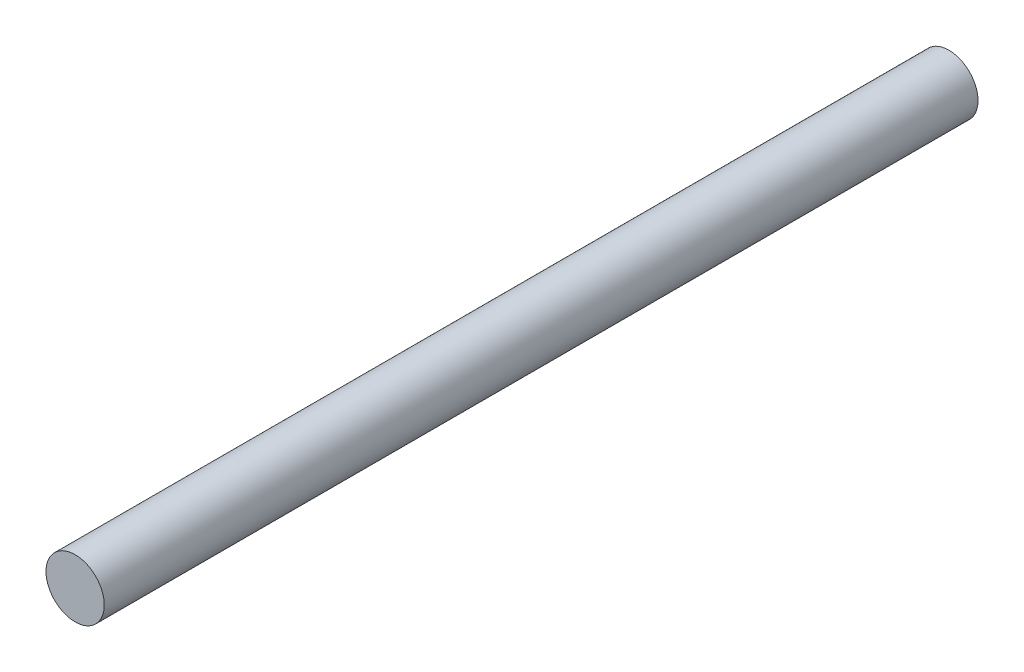
ISO-10303-21;
HEADER;
FILE_DESCRIPTION(('STEP AP214'),'2;1');
FILE_NAME('part.step','',(''),(''),'','','');
FILE_SCHEMA(('AUTOMOTIVE_DESIGN { 1 0 10303 214 1 1 1 1 }'));
ENDSEC;
DATA;
#1=APPLICATION_CONTEXT('core data for automotive mechanical design processes');
#2=APPLICATION_PROTOCOL_DEFINITION('international standard','automotive_design',2000,#1);
#3=PRODUCT_CONTEXT('',#1,'mechanical');
#4=PRODUCT('Part','Part','',(#3));
#5=PRODUCT_RELATED_PRODUCT_CATEGORY('part','',(#4));
#6=PRODUCT_DEFINITION_FORMATION('','',#4);
#7=PRODUCT_DEFINITION_CONTEXT('part definition',#1,'design');
#8=PRODUCT_DEFINITION('design','',#6,#7);
#9=PRODUCT_DEFINITION_SHAPE('','',#8);
#10=(LENGTH_UNIT() NAMED_UNIT(*) SI_UNIT(.MILLI.,.METRE.));
#11=(NAMED_UNIT(*) PLANE_ANGLE_UNIT() SI_UNIT($,.RADIAN.));
#12=(NAMED_UNIT(*) SI_UNIT($,.STERADIAN.) SOLID_ANGLE_UNIT());
#13=UNCERTAINTY_MEASURE_WITH_UNIT(LENGTH_MEASURE(1.E-05),#10,'distance_accuracy_value','');
#14=(GEOMETRIC_REPRESENTATION_CONTEXT(3) GLOBAL_UNCERTAINTY_ASSIGNED_CONTEXT((#13)) GLOBAL_UNIT_ASSIGNED_CONTEXT((#10,
#11,#12)) REPRESENTATION_CONTEXT('',''));
#15=CARTESIAN_POINT('',(0.,0.,0.));
#16=DIRECTION('',(0.,0.,1.));
#17=DIRECTION('',(1.,0.,0.));
#18=AXIS2_PLACEMENT_3D('',#15,#16,#17);
#19=CARTESIAN_POINT('',(0.,0.,90.));
#20=DIRECTION('',(0.,0.,-1.));
#21=DIRECTION('',(-1.,0.,0.));
#22=AXIS2_PLACEMENT_3D('',#19,#20,#21);
#23=CYLINDRICAL_SURFACE('',#22,3.);
#24=CARTESIAN_POINT('',(0.,0.,90.));
#25=DIRECTION('',(0.,0.,1.));
#26=DIRECTION('',(1.,0.,0.));
#27=AXIS2_PLACEMENT_3D('',#24,#25,#26);
#28=CIRCLE('',#27,3.);
#29=CARTESIAN_POINT('',(-3.,0.,90.));
#30=VERTEX_POINT('',#29);
#31=EDGE_CURVE('E10',#30,#30,#28,.T.);
#32=CARTESIAN_POINT('',(0.,0.,0.));
#33=DIRECTION('',(0.,0.,1.));
#34=DIRECTION('',(1.,0.,0.));
#35=AXIS2_PLACEMENT_3D('',#32,#33,#34);
#36=CIRCLE('',#35,3.);
#37=CARTESIAN_POINT('',(-3.,0.,0.));
#38=VERTEX_POINT('',#37);
#39=EDGE_CURVE('E40',#38,#38,#36,.T.);
#40=CARTESIAN_POINT('',(-3.,0.,90.));
#41=CARTESIAN_POINT('',(-3.,0.,89.0625));
#42=CARTESIAN_POINT('',(-3.,0.,88.125));
#43=CARTESIAN_POINT('',(-3.,0.,86.25));
#44=CARTESIAN_POINT('',(-3.,0.,85.3125));
#45=CARTESIAN_POINT('',(-3.,0.,83.4375));
#46=CARTESIAN_POINT('',(-3.,0.,82.5));
#47=CARTESIAN_POINT('',(-3.,0.,80.625));
#48=CARTESIAN_POINT('',(-3.,0.,79.6875));
#49=CARTESIAN_POINT('',(-3.,0.,77.8125));
#50=CARTESIAN_POINT('',(-3.,0.,76.875));
#51=CARTESIAN_POINT('',(-3.,0.,75.));
#52=CARTESIAN_POINT('',(-3.,0.,74.0625));
#53=CARTESIAN_POINT('',(-3.,0.,72.1875));
#54=CARTESIAN_POINT('',(-3.,0.,71.25));
#55=CARTESIAN_POINT('',(-3.,0.,69.375));
#56=CARTESIAN_POINT('',(-3.,0.,68.4375));
#57=CARTESIAN_POINT('',(-3.,0.,66.5625));
#58=CARTESIAN_POINT('',(-3.,0.,65.625));
#59=CARTESIAN_POINT('',(-3.,0.,63.75));
#60=CARTESIAN_POINT('',(-3.,0.,62.8125));
#61=CARTESIAN_POINT('',(-3.,0.,60.9375));
#62=CARTESIAN_POINT('',(-3.,0.,60.));
#63=CARTESIAN_POINT('',(-3.,0.,58.125));
#64=CARTESIAN_POINT('',(-3.,0.,57.1875));
#65=CARTESIAN_POINT('',(-3.,0.,55.3125));
#66=CARTESIAN_POINT('',(-3.,0.,54.375));
#67=CARTESIAN_POINT('',(-3.,0.,52.5));
#68=CARTESIAN_POINT('',(-3.,0.,51.5625));
#69=CARTESIAN_POINT('',(-3.,0.,49.6875));
#70=CARTESIAN_POINT('',(-3.,0.,48.75));
#71=CARTESIAN_POINT('',(-3.,0.,46.875));
#72=CARTESIAN_POINT('',(-3.,0.,45.9375));
#73=CARTESIAN_POINT('',(-3.,0.,44.0625));
#74=CARTESIAN_POINT('',(-3.,0.,43.125));
#75=CARTESIAN_POINT('',(-3.,0.,41.25));
#76=CARTESIAN_POINT('',(-3.,0.,40.3125));
#77=CARTESIAN_POINT('',(-3.,0.,38.4375));
#78=CARTESIAN_POINT('',(-3.,0.,37.5));
#79=CARTESIAN_POINT('',(-3.,0.,35.625));
#80=CARTESIAN_POINT('',(-3.,0.,34.6875));
#81=CARTESIAN_POINT('',(-3.,0.,32.8125));
#82=CARTESIAN_POINT('',(-3.,0.,31.875));
#83=CARTESIAN_POINT('',(-3.,0.,30.));
#84=CARTESIAN_POINT('',(-3.,0.,29.0625));
#85=CARTESIAN_POINT('',(-3.,0.,27.1875));
#86=CARTESIAN_POINT('',(-3.,0.,26.25));
#87=CARTESIAN_POINT('',(-3.,0.,24.375));
#88=CARTESIAN_POINT('',(-3.,0.,23.4375));
#89=CARTESIAN_POINT('',(-3.,0.,21.5625));
#90=CARTESIAN_POINT('',(-3.,0.,20.625));
#91=CARTESIAN_POINT('',(-3.,0.,18.75));
#92=CARTESIAN_POINT('',(-3.,0.,17.8125));
#93=CARTESIAN_POINT('',(-3.,0.,15.9375));
#94=CARTESIAN_POINT('',(-3.,0.,15.));
#95=CARTESIAN_POINT('',(-3.,0.,13.125));
#96=CARTESIAN_POINT('',(-3.,0.,12.1875));
#97=CARTESIAN_POINT('',(-3.,0.,10.3125));
#98=CARTESIAN_POINT('',(-3.,0.,9.37499999999999));
#99=CARTESIAN_POINT('',(-3.,0.,7.49999999999999));
#100=CARTESIAN_POINT('',(-3.,0.,6.56249999999999));
#101=CARTESIAN_POINT('',(-3.,0.,4.68749999999999));
#102=CARTESIAN_POINT('',(-3.,0.,3.74999999999998));
#103=CARTESIAN_POINT('',(-3.,0.,1.87499999999998));
#104=CARTESIAN_POINT('',(-3.,0.,0.937499999999986));
#105=CARTESIAN_POINT('',(-3.,0.,0.));
#106=B_SPLINE_CURVE_WITH_KNOTS('',3,(#40,#41,#42,#43,#44,#45,#46,#47,#48,#49,#50,#51,#52,#53,
#54,#55,#56,#57,#58,#59,#60,#61,#62,#63,#64,#65,#66,#67,#68,#69,#70,#71,#72,#73,#74,#75,#76,#77,
#78,#79,#80,#81,#82,#83,#84,#85,#86,#87,#88,#89,#90,#91,#92,#93,#94,#95,#96,#97,#98,#99,#100,
#101,#102,#103,#104,#105),.UNSPECIFIED.,.F.,.F.,(4,2,2,2,2,2,2,2,2,2,2,2,2,2,2,2,2,2,2,2,2,2,2,
2,2,2,2,2,2,2,2,2,4),(0.,2.8125,5.62499999999999,8.43749999999999,11.25,14.0625,16.875,19.6875,
22.5,25.3125,28.125,30.9375,33.75,36.5625,39.375,42.1875,45.,47.8125,50.625,53.4375,56.25,
59.0625,61.875,64.6875,67.5,70.3125,73.125,75.9375,78.75,81.5625,84.375,87.1875,90.),.UNSPECIFIED.);
#107=EDGE_CURVE('BSEAM37',#30,#38,#106,.T.);
#108=ORIENTED_EDGE('',*,*,#31,.F.);
#109=ORIENTED_EDGE('',*,*,#39,.T.);
#110=ORIENTED_EDGE('',*,*,#107,.T.);
#111=ORIENTED_EDGE('',*,*,#107,.F.);
#112=EDGE_LOOP('',(#108,#110,#109,#111));
#113=FACE_BOUND('',#112,.T.);
#114=ADVANCED_FACE('F37',(#113),#23,.T.);
#115=CARTESIAN_POINT('',(0.,0.,90.));
#116=DIRECTION('',(0.,0.,1.));
#117=DIRECTION('',(1.,0.,0.));
#118=AXIS2_PLACEMENT_3D('',#115,#116,#117);
#119=PLANE('',#118);
#120=ORIENTED_EDGE('',*,*,#31,.T.);
#121=EDGE_LOOP('',(#120));
#122=FACE_BOUND('',#121,.T.);
#123=ADVANCED_FACE('F54',(#122),#119,.T.);
#124=CARTESIAN_POINT('',(0.,0.,0.));
#125=DIRECTION('',(0.,0.,1.));
#126=DIRECTION('',(1.,0.,0.));
#127=AXIS2_PLACEMENT_3D('',#124,#125,#126);
#128=PLANE('',#127);
#129=ORIENTED_EDGE('',*,*,#39,.F.);
#130=EDGE_LOOP('',(#129));
#131=FACE_BOUND('',#130,.T.);
#132=ADVANCED_FACE('F52',(#131),#128,.F.);
#133=CLOSED_SHELL('',(#114,#123,#132));
#134=MANIFOLD_SOLID_BREP('B2',#133);
#135=ADVANCED_BREP_SHAPE_REPRESENTATION('',(#18,#134),#14);
#136=SHAPE_DEFINITION_REPRESENTATION(#9,#135);
ENDSEC;
END-ISO-10303-21;
